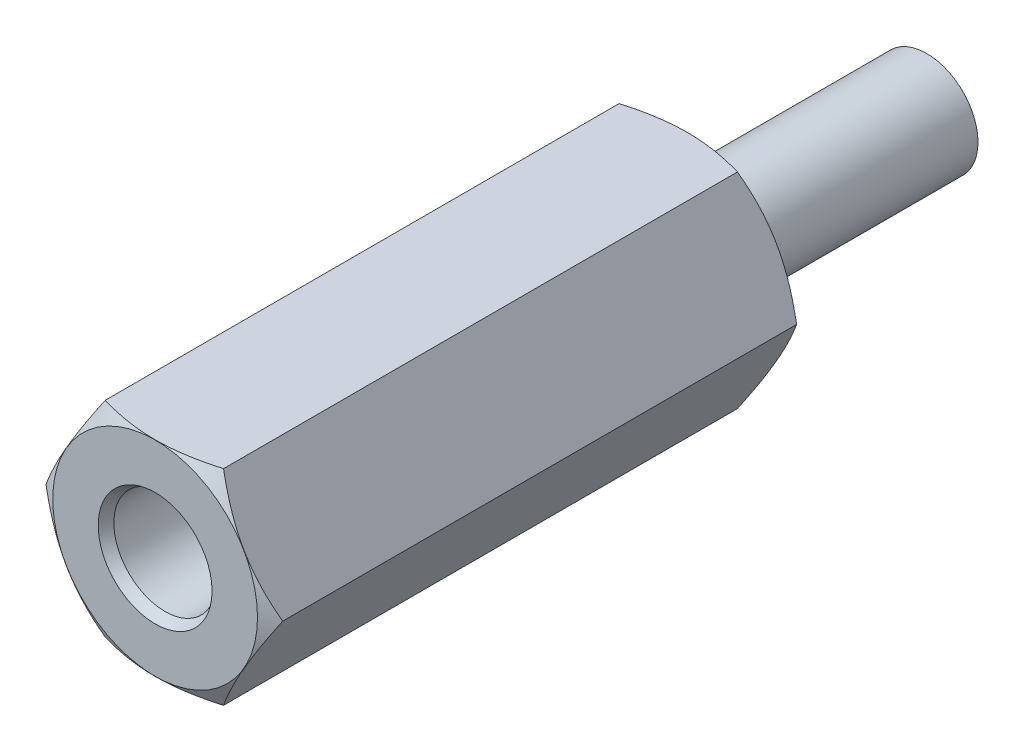
ISO-10303-21;
HEADER;
FILE_DESCRIPTION(('STEP AP214'),'2;1');
FILE_NAME('part.step','',(''),(''),'','','');
FILE_SCHEMA(('AUTOMOTIVE_DESIGN { 1 0 10303 214 1 1 1 1 }'));
ENDSEC;
DATA;
#1=APPLICATION_CONTEXT('core data for automotive mechanical design processes');
#2=APPLICATION_PROTOCOL_DEFINITION('international standard','automotive_design',2000,#1);
#3=PRODUCT_CONTEXT('',#1,'mechanical');
#4=PRODUCT('Part','Part','',(#3));
#5=PRODUCT_RELATED_PRODUCT_CATEGORY('part','',(#4));
#6=PRODUCT_DEFINITION_FORMATION('','',#4);
#7=PRODUCT_DEFINITION_CONTEXT('part definition',#1,'design');
#8=PRODUCT_DEFINITION('design','',#6,#7);
#9=PRODUCT_DEFINITION_SHAPE('','',#8);
#10=(LENGTH_UNIT() NAMED_UNIT(*) SI_UNIT(.MILLI.,.METRE.));
#11=(NAMED_UNIT(*) PLANE_ANGLE_UNIT() SI_UNIT($,.RADIAN.));
#12=(NAMED_UNIT(*) SI_UNIT($,.STERADIAN.) SOLID_ANGLE_UNIT());
#13=UNCERTAINTY_MEASURE_WITH_UNIT(LENGTH_MEASURE(1.E-05),#10,'distance_accuracy_value','');
#14=(GEOMETRIC_REPRESENTATION_CONTEXT(3) GLOBAL_UNCERTAINTY_ASSIGNED_CONTEXT((#13)) GLOBAL_UNIT_ASSIGNED_CONTEXT((#10,
#11,#12)) REPRESENTATION_CONTEXT('',''));
#15=CARTESIAN_POINT('',(0.,0.,0.));
#16=DIRECTION('',(0.,0.,1.));
#17=DIRECTION('',(1.,0.,0.));
#18=AXIS2_PLACEMENT_3D('',#15,#16,#17);
#19=CARTESIAN_POINT('',(0.,0.,7.));
#20=DIRECTION('',(0.,0.,1.));
#21=DIRECTION('',(1.,0.,0.));
#22=AXIS2_PLACEMENT_3D('',#19,#20,#21);
#23=CONICAL_SURFACE('',#22,1.25,1.047197551197);
#24=CARTESIAN_POINT('',(0.,0.,7.));
#25=DIRECTION('',(0.,0.,1.));
#26=DIRECTION('',(1.,0.,0.));
#27=AXIS2_PLACEMENT_3D('',#24,#25,#26);
#28=CIRCLE('',#27,1.25);
#29=CARTESIAN_POINT('',(1.25,0.,7.));
#30=VERTEX_POINT('',#29);
#31=EDGE_CURVE('E26',#30,#30,#28,.T.);
#32=ORIENTED_EDGE('',*,*,#31,.T.);
#33=DIRECTION('',(-0.866025403784329,0.,-0.50000000000019));
#34=VECTOR('',#33,1.);
#35=CARTESIAN_POINT('',(1.25,0.,7.));
#36=LINE('',#35,#34);
#37=CARTESIAN_POINT('',(0.,0.,6.278312163513));
#38=VERTEX_POINT('',#37);
#39=EDGE_CURVE('E11',#30,#38,#36,.T.);
#40=ORIENTED_EDGE('',*,*,#39,.T.);
#41=ORIENTED_EDGE('',*,*,#39,.F.);
#42=EDGE_LOOP('',(#32,#40,#41));
#43=FACE_BOUND('',#42,.T.);
#44=ADVANCED_FACE('F16',(#43),#23,.F.);
#45=CARTESIAN_POINT('',(0.,0.,-6.));
#46=DIRECTION('',(0.,0.,1.));
#47=DIRECTION('',(1.,0.,0.));
#48=AXIS2_PLACEMENT_3D('',#45,#46,#47);
#49=PLANE('',#48);
#50=CARTESIAN_POINT('',(0.,0.,-6.));
#51=DIRECTION('',(0.,0.,1.));
#52=DIRECTION('',(1.,0.,0.));
#53=AXIS2_PLACEMENT_3D('',#50,#51,#52);
#54=CIRCLE('',#53,0.98);
#55=CARTESIAN_POINT('',(0.98,0.,-6.));
#56=VERTEX_POINT('',#55);
#57=EDGE_CURVE('E100',#56,#56,#54,.T.);
#58=ORIENTED_EDGE('',*,*,#57,.F.);
#59=EDGE_LOOP('',(#58));
#60=FACE_BOUND('',#59,.T.);
#61=ADVANCED_FACE('F297',(#60),#49,.F.);
#62=CARTESIAN_POINT('',(0.,0.,12.75751288694));
#63=DIRECTION('',(0.,0.,-1.));
#64=DIRECTION('',(1.,0.,0.));
#65=AXIS2_PLACEMENT_3D('',#62,#63,#64);
#66=CYLINDRICAL_SURFACE('',#65,1.25);
#67=CARTESIAN_POINT('',(0.,0.,12.75751288694));
#68=DIRECTION('',(0.,0.,1.));
#69=DIRECTION('',(1.,0.,0.));
#70=AXIS2_PLACEMENT_3D('',#67,#68,#69);
#71=CIRCLE('',#70,1.25);
#72=CARTESIAN_POINT('',(1.25,0.,12.75751288694));
#73=VERTEX_POINT('',#72);
#74=EDGE_CURVE('E114',#73,#73,#71,.T.);
#75=ORIENTED_EDGE('',*,*,#74,.T.);
#76=DIRECTION('',(0.,0.,-1.));
#77=VECTOR('',#76,1.);
#78=CARTESIAN_POINT('',(1.25,0.,12.75751288694));
#79=LINE('',#78,#77);
#80=EDGE_CURVE('E105',#73,#30,#79,.T.);
#81=ORIENTED_EDGE('',*,*,#80,.T.);
#82=ORIENTED_EDGE('',*,*,#31,.F.);
#83=ORIENTED_EDGE('',*,*,#80,.F.);
#84=EDGE_LOOP('',(#75,#81,#82,#83));
#85=FACE_BOUND('',#84,.T.);
#86=ADVANCED_FACE('F294',(#85),#66,.F.);
#87=CARTESIAN_POINT('',(0.,0.,-6.));
#88=DIRECTION('',(0.,0.,1.));
#89=DIRECTION('',(1.,0.,0.));
#90=AXIS2_PLACEMENT_3D('',#87,#88,#89);
#91=CONICAL_SURFACE('',#90,0.98,1.047197551197);
#92=ORIENTED_EDGE('',*,*,#57,.T.);
#93=DIRECTION('',(0.866025403784329,0.,0.50000000000019));
#94=VECTOR('',#93,1.);
#95=CARTESIAN_POINT('',(0.98,0.,-6.));
#96=LINE('',#95,#94);
#97=CARTESIAN_POINT('',(1.25,0.,-5.844115427319));
#98=VERTEX_POINT('',#97);
#99=EDGE_CURVE('E97',#56,#98,#96,.T.);
#100=ORIENTED_EDGE('',*,*,#99,.T.);
#101=CARTESIAN_POINT('',(0.,0.,-5.844115427319));
#102=DIRECTION('',(0.,0.,1.));
#103=DIRECTION('',(1.,0.,0.));
#104=AXIS2_PLACEMENT_3D('',#101,#102,#103);
#105=CIRCLE('',#104,1.25);
#106=EDGE_CURVE('E102',#98,#98,#105,.T.);
#107=ORIENTED_EDGE('',*,*,#106,.F.);
#108=ORIENTED_EDGE('',*,*,#99,.F.);
#109=EDGE_LOOP('',(#92,#100,#107,#108));
#110=FACE_BOUND('',#109,.T.);
#111=ADVANCED_FACE('F98',(#110),#91,.T.);
#112=CARTESIAN_POINT('',(0.,0.,13.));
#113=DIRECTION('',(0.,0.,1.));
#114=DIRECTION('',(1.,0.,0.));
#115=AXIS2_PLACEMENT_3D('',#112,#113,#114);
#116=CONICAL_SURFACE('',#115,1.39,0.523598775598);
#117=CARTESIAN_POINT('',(0.,0.,13.));
#118=DIRECTION('',(0.,0.,1.));
#119=DIRECTION('',(1.,0.,0.));
#120=AXIS2_PLACEMENT_3D('',#117,#118,#119);
#121=CIRCLE('',#120,1.39);
#122=CARTESIAN_POINT('',(1.39,0.,13.));
#123=VERTEX_POINT('',#122);
#124=EDGE_CURVE('E136',#123,#123,#121,.T.);
#125=ORIENTED_EDGE('',*,*,#124,.T.);
#126=DIRECTION('',(-0.50000000000019,0.,-0.866025403784329));
#127=VECTOR('',#126,1.);
#128=CARTESIAN_POINT('',(1.39,0.,13.));
#129=LINE('',#128,#127);
#130=EDGE_CURVE('E199',#123,#73,#129,.T.);
#131=ORIENTED_EDGE('',*,*,#130,.T.);
#132=ORIENTED_EDGE('',*,*,#74,.F.);
#133=ORIENTED_EDGE('',*,*,#130,.F.);
#134=EDGE_LOOP('',(#125,#131,#132,#133));
#135=FACE_BOUND('',#134,.T.);
#136=ADVANCED_FACE('F291',(#135),#116,.F.);
#137=CARTESIAN_POINT('',(0.,0.,-5.844115427319));
#138=DIRECTION('',(0.,0.,1.));
#139=DIRECTION('',(1.,0.,0.));
#140=AXIS2_PLACEMENT_3D('',#137,#138,#139);
#141=CYLINDRICAL_SURFACE('',#140,1.25);
#142=ORIENTED_EDGE('',*,*,#106,.T.);
#143=DIRECTION('',(0.,0.,1.));
#144=VECTOR('',#143,1.);
#145=CARTESIAN_POINT('',(1.25,0.,-5.844115427319));
#146=LINE('',#145,#144);
#147=CARTESIAN_POINT('',(1.25,0.,0.));
#148=VERTEX_POINT('',#147);
#149=EDGE_CURVE('E203',#98,#148,#146,.T.);
#150=ORIENTED_EDGE('',*,*,#149,.T.);
#151=CARTESIAN_POINT('',(0.,0.,0.));
#152=DIRECTION('',(0.,0.,1.));
#153=DIRECTION('',(1.,0.,0.));
#154=AXIS2_PLACEMENT_3D('',#151,#152,#153);
#155=CIRCLE('',#154,1.25);
#156=EDGE_CURVE('E140',#148,#148,#155,.T.);
#157=ORIENTED_EDGE('',*,*,#156,.F.);
#158=ORIENTED_EDGE('',*,*,#149,.F.);
#159=EDGE_LOOP('',(#142,#150,#157,#158));
#160=FACE_BOUND('',#159,.T.);
#161=ADVANCED_FACE('F325',(#160),#141,.T.);
#162=CARTESIAN_POINT('',(0.,0.,13.));
#163=DIRECTION('',(0.,0.,1.));
#164=DIRECTION('',(1.,0.,0.));
#165=AXIS2_PLACEMENT_3D('',#162,#163,#164);
#166=PLANE('',#165);
#167=ORIENTED_EDGE('',*,*,#124,.F.);
#168=EDGE_LOOP('',(#167));
#169=FACE_BOUND('',#168,.T.);
#170=CARTESIAN_POINT('',(0.,0.,13.));
#171=DIRECTION('',(0.,0.,1.));
#172=DIRECTION('',(1.,0.,0.));
#173=AXIS2_PLACEMENT_3D('',#170,#171,#172);
#174=CIRCLE('',#173,2.5);
#175=CARTESIAN_POINT('',(2.5,0.,13.));
#176=VERTEX_POINT('',#175);
#177=EDGE_CURVE('E156',#176,#176,#174,.T.);
#178=ORIENTED_EDGE('',*,*,#177,.T.);
#179=EDGE_LOOP('',(#178));
#180=FACE_BOUND('',#179,.T.);
#181=ADVANCED_FACE('F326',(#169,#180),#166,.T.);
#182=CARTESIAN_POINT('',(0.,0.,0.));
#183=DIRECTION('',(0.,0.,1.));
#184=DIRECTION('',(1.,0.,0.));
#185=AXIS2_PLACEMENT_3D('',#182,#183,#184);
#186=PLANE('',#185);
#187=CARTESIAN_POINT('',(0.,0.,0.));
#188=DIRECTION('',(0.,0.,1.));
#189=DIRECTION('',(1.,0.,0.));
#190=AXIS2_PLACEMENT_3D('',#187,#188,#189);
#191=CIRCLE('',#190,2.5);
#192=CARTESIAN_POINT('',(2.5,0.,0.));
#193=VERTEX_POINT('',#192);
#194=EDGE_CURVE('E134',#193,#193,#191,.T.);
#195=ORIENTED_EDGE('',*,*,#194,.F.);
#196=EDGE_LOOP('',(#195));
#197=FACE_BOUND('',#196,.T.);
#198=ORIENTED_EDGE('',*,*,#156,.T.);
#199=EDGE_LOOP('',(#198));
#200=FACE_BOUND('',#199,.T.);
#201=ADVANCED_FACE('F329',(#197,#200),#186,.F.);
#202=CARTESIAN_POINT('',(-1.445,-2.502813416937,-10.));
#203=DIRECTION('',(0.,1.,0.));
#204=DIRECTION('',(1.,0.,0.));
#205=AXIS2_PLACEMENT_3D('',#202,#203,#204);
#206=PLANE('',#205);
#207=DIRECTION('',(0.,0.,1.));
#208=VECTOR('',#207,1.);
#209=CARTESIAN_POINT('',(1.445,-2.502813416937,-10.));
#210=LINE('',#209,#208);
#211=CARTESIAN_POINT('',(1.445,-2.502813416937,0.225166604984));
#212=VERTEX_POINT('',#211);
#213=CARTESIAN_POINT('',(1.445,-2.502813416937,12.774833395016));
#214=VERTEX_POINT('',#213);
#215=EDGE_CURVE('E146',#212,#214,#210,.T.);
#216=ORIENTED_EDGE('',*,*,#215,.T.);
#217=CARTESIAN_POINT('',(1.44500000000008,-2.502813416937,12.7748333950159));
#218=CARTESIAN_POINT('',(0.,-2.50281341693701,13.1919689645055));
#219=CARTESIAN_POINT('',(-1.44499999999997,-2.502813416937,12.774833395016));
#220=(BOUNDED_CURVE() B_SPLINE_CURVE(2,(#217,#218,#219),.UNSPECIFIED.,.F.,
.F.) B_SPLINE_CURVE_WITH_KNOTS((3,3),(0.,1.),
.UNSPECIFIED.) CURVE() GEOMETRIC_REPRESENTATION_ITEM() RATIONAL_B_SPLINE_CURVE((1.,
1.15470053837926,1.)) REPRESENTATION_ITEM(''));
#221=CARTESIAN_POINT('',(-1.445,-2.502813416937,12.774833395016));
#222=VERTEX_POINT('',#221);
#223=EDGE_CURVE('E141',#214,#222,#220,.T.);
#224=ORIENTED_EDGE('',*,*,#223,.T.);
#225=DIRECTION('',(0.,0.,1.));
#226=VECTOR('',#225,1.);
#227=CARTESIAN_POINT('',(-1.445,-2.502813416937,-10.));
#228=LINE('',#227,#226);
#229=CARTESIAN_POINT('',(-1.445,-2.502813416937,0.225166604984));
#230=VERTEX_POINT('',#229);
#231=EDGE_CURVE('E236',#230,#222,#228,.T.);
#232=ORIENTED_EDGE('',*,*,#231,.F.);
#233=CARTESIAN_POINT('',(-1.44500000000008,-2.502813416937,0.225166604984046));
#234=CARTESIAN_POINT('',(0.,-2.50281341693701,-0.191968964505495));
#235=CARTESIAN_POINT('',(1.44499999999997,-2.502813416937,0.225166604984016));
#236=(BOUNDED_CURVE() B_SPLINE_CURVE(2,(#233,#234,#235),.UNSPECIFIED.,.F.,
.F.) B_SPLINE_CURVE_WITH_KNOTS((3,3),(0.,1.),
.UNSPECIFIED.) CURVE() GEOMETRIC_REPRESENTATION_ITEM() RATIONAL_B_SPLINE_CURVE((1.,
1.15470053837926,1.)) REPRESENTATION_ITEM(''));
#237=EDGE_CURVE('E120',#230,#212,#236,.T.);
#238=ORIENTED_EDGE('',*,*,#237,.T.);
#239=EDGE_LOOP('',(#216,#224,#232,#238));
#240=FACE_BOUND('',#239,.T.);
#241=ADVANCED_FACE('F333',(#240),#206,.F.);
#242=CARTESIAN_POINT('',(-2.89,0.,-10.));
#243=DIRECTION('',(0.866025403784329,0.50000000000019,0.));
#244=DIRECTION('',(0.,0.,-1.));
#245=AXIS2_PLACEMENT_3D('',#242,#243,#244);
#246=PLANE('',#245);
#247=ORIENTED_EDGE('',*,*,#231,.T.);
#248=CARTESIAN_POINT('',(-1.44499999999986,-2.50281341693713,12.7748333950159));
#249=CARTESIAN_POINT('',(-2.16750000000005,-1.25140670846891,13.1919689645056));
#250=CARTESIAN_POINT('',(-2.89000000000029,-6.22391027604863E-13,12.7748333950158));
#251=(BOUNDED_CURVE() B_SPLINE_CURVE(2,(#248,#249,#250),.UNSPECIFIED.,.F.,
.F.) B_SPLINE_CURVE_WITH_KNOTS((3,3),(0.,1.),
.UNSPECIFIED.) CURVE() GEOMETRIC_REPRESENTATION_ITEM() RATIONAL_B_SPLINE_CURVE((1.,
1.15470053837933,1.)) REPRESENTATION_ITEM(''));
#252=CARTESIAN_POINT('',(-2.89,0.,12.774833395016));
#253=VERTEX_POINT('',#252);
#254=EDGE_CURVE('E147',#222,#253,#251,.T.);
#255=ORIENTED_EDGE('',*,*,#254,.T.);
#256=DIRECTION('',(0.,0.,1.));
#257=VECTOR('',#256,1.);
#258=CARTESIAN_POINT('',(-2.89,0.,-10.));
#259=LINE('',#258,#257);
#260=CARTESIAN_POINT('',(-2.89,0.,0.225166604984));
#261=VERTEX_POINT('',#260);
#262=EDGE_CURVE('E118',#261,#253,#259,.T.);
#263=ORIENTED_EDGE('',*,*,#262,.F.);
#264=CARTESIAN_POINT('',(-2.89000000000094,5.09592368302947E-13,0.225166604984566));
#265=CARTESIAN_POINT('',(-2.16750000000034,-1.2514067084684,-0.191968964505698));
#266=CARTESIAN_POINT('',(-1.44499999999998,-2.50281341693691,0.225166604984036));
#267=(BOUNDED_CURVE() B_SPLINE_CURVE(2,(#264,#265,#266),.UNSPECIFIED.,.F.,
.F.) B_SPLINE_CURVE_WITH_KNOTS((3,3),(0.,1.),
.UNSPECIFIED.) CURVE() GEOMETRIC_REPRESENTATION_ITEM() RATIONAL_B_SPLINE_CURVE((1.,
1.15470053837945,1.)) REPRESENTATION_ITEM(''));
#268=EDGE_CURVE('E125',#261,#230,#267,.T.);
#269=ORIENTED_EDGE('',*,*,#268,.T.);
#270=EDGE_LOOP('',(#247,#255,#263,#269));
#271=FACE_BOUND('',#270,.T.);
#272=ADVANCED_FACE('F314',(#271),#246,.F.);
#273=CARTESIAN_POINT('',(-1.445,2.502813416937,-10.));
#274=DIRECTION('',(0.866025403784329,-0.50000000000019,0.));
#275=DIRECTION('',(0.,0.,-1.));
#276=AXIS2_PLACEMENT_3D('',#273,#274,#275);
#277=PLANE('',#276);
#278=ORIENTED_EDGE('',*,*,#262,.T.);
#279=CARTESIAN_POINT('',(-2.89000000000108,-7.48068273992431E-13,12.7748333950154));
#280=CARTESIAN_POINT('',(-2.1675000000004,1.25140670846831,13.1919689645058));
#281=CARTESIAN_POINT('',(-1.44499999999998,2.50281341693692,12.774833395016));
#282=(BOUNDED_CURVE() B_SPLINE_CURVE(2,(#279,#280,#281),.UNSPECIFIED.,.F.,
.F.) B_SPLINE_CURVE_WITH_KNOTS((3,3),(0.,1.),
.UNSPECIFIED.) CURVE() GEOMETRIC_REPRESENTATION_ITEM() RATIONAL_B_SPLINE_CURVE((1.,
1.15470053837947,1.)) REPRESENTATION_ITEM(''));
#283=CARTESIAN_POINT('',(-1.445,2.502813416937,12.774833395016));
#284=VERTEX_POINT('',#283);
#285=EDGE_CURVE('E169',#253,#284,#282,.T.);
#286=ORIENTED_EDGE('',*,*,#285,.T.);
#287=DIRECTION('',(0.,0.,1.));
#288=VECTOR('',#287,1.);
#289=CARTESIAN_POINT('',(-1.445,2.502813416937,-10.));
#290=LINE('',#289,#288);
#291=CARTESIAN_POINT('',(-1.445,2.502813416937,0.225166604984));
#292=VERTEX_POINT('',#291);
#293=EDGE_CURVE('E19',#292,#284,#290,.T.);
#294=ORIENTED_EDGE('',*,*,#293,.F.);
#295=CARTESIAN_POINT('',(-1.44499999999986,2.50281341693713,0.225166604984106));
#296=CARTESIAN_POINT('',(-2.16750000000007,1.25140670846888,-0.191968964505593));
#297=CARTESIAN_POINT('',(-2.89000000000033,5.42899059041702E-13,0.225166604984216));
#298=(BOUNDED_CURVE() B_SPLINE_CURVE(2,(#295,#296,#297),.UNSPECIFIED.,.F.,
.F.) B_SPLINE_CURVE_WITH_KNOTS((3,3),(0.,1.),
.UNSPECIFIED.) CURVE() GEOMETRIC_REPRESENTATION_ITEM() RATIONAL_B_SPLINE_CURVE((1.,
1.15470053837935,1.)) REPRESENTATION_ITEM(''));
#299=EDGE_CURVE('E183',#292,#261,#298,.T.);
#300=ORIENTED_EDGE('',*,*,#299,.T.);
#301=EDGE_LOOP('',(#278,#286,#294,#300));
#302=FACE_BOUND('',#301,.T.);
#303=ADVANCED_FACE('F310',(#302),#277,.F.);
#304=CARTESIAN_POINT('',(1.445,-2.502813416937,-10.));
#305=DIRECTION('',(-0.866025403784329,0.50000000000019,0.));
#306=DIRECTION('',(0.,0.,1.));
#307=AXIS2_PLACEMENT_3D('',#304,#305,#306);
#308=PLANE('',#307);
#309=DIRECTION('',(0.,0.,1.));
#310=VECTOR('',#309,1.);
#311=CARTESIAN_POINT('',(2.89,0.,0.225166604984));
#312=LINE('',#311,#310);
#313=CARTESIAN_POINT('',(2.89,0.,0.225166604984));
#314=VERTEX_POINT('',#313);
#315=CARTESIAN_POINT('',(2.89,0.,12.774833395016));
#316=VERTEX_POINT('',#315);
#317=EDGE_CURVE('E163',#314,#316,#312,.T.);
#318=ORIENTED_EDGE('',*,*,#317,.T.);
#319=CARTESIAN_POINT('',(2.89000000000101,6.32827124036339E-13,12.7748333950154));
#320=CARTESIAN_POINT('',(2.16750000000037,-1.25140670846836,13.1919689645057));
#321=CARTESIAN_POINT('',(1.44499999999998,-2.50281341693692,12.774833395016));
#322=(BOUNDED_CURVE() B_SPLINE_CURVE(2,(#319,#320,#321),.UNSPECIFIED.,.F.,
.F.) B_SPLINE_CURVE_WITH_KNOTS((3,3),(0.,1.),
.UNSPECIFIED.) CURVE() GEOMETRIC_REPRESENTATION_ITEM() RATIONAL_B_SPLINE_CURVE((1.,
1.15470053837946,1.)) REPRESENTATION_ITEM(''));
#323=EDGE_CURVE('E157',#316,#214,#322,.T.);
#324=ORIENTED_EDGE('',*,*,#323,.T.);
#325=ORIENTED_EDGE('',*,*,#215,.F.);
#326=CARTESIAN_POINT('',(1.44499999999986,-2.50281341693713,0.225166604984106));
#327=CARTESIAN_POINT('',(2.16750000000006,-1.25140670846889,-0.191968964505588));
#328=CARTESIAN_POINT('',(2.89000000000031,-5.83089132533132E-13,0.225166604984202));
#329=(BOUNDED_CURVE() B_SPLINE_CURVE(2,(#326,#327,#328),.UNSPECIFIED.,.F.,
.F.) B_SPLINE_CURVE_WITH_KNOTS((3,3),(0.,1.),
.UNSPECIFIED.) CURVE() GEOMETRIC_REPRESENTATION_ITEM() RATIONAL_B_SPLINE_CURVE((1.,
1.15470053837935,1.)) REPRESENTATION_ITEM(''));
#330=EDGE_CURVE('E126',#212,#314,#329,.T.);
#331=ORIENTED_EDGE('',*,*,#330,.T.);
#332=EDGE_LOOP('',(#318,#324,#325,#331));
#333=FACE_BOUND('',#332,.T.);
#334=ADVANCED_FACE('F313',(#333),#308,.F.);
#335=CARTESIAN_POINT('',(0.,0.,12.774833395016));
#336=DIRECTION('',(0.,0.,-1.));
#337=DIRECTION('',(1.,0.,0.));
#338=AXIS2_PLACEMENT_3D('',#335,#336,#337);
#339=CONICAL_SURFACE('',#338,2.89,1.047197551197);
#340=ORIENTED_EDGE('',*,*,#323,.F.);
#341=DIRECTION('',(-0.866025403784329,0.,0.50000000000019));
#342=VECTOR('',#341,1.);
#343=CARTESIAN_POINT('',(2.89,0.,12.774833395016));
#344=LINE('',#343,#342);
#345=EDGE_CURVE('E152',#316,#176,#344,.T.);
#346=ORIENTED_EDGE('',*,*,#345,.T.);
#347=ORIENTED_EDGE('',*,*,#177,.F.);
#348=ORIENTED_EDGE('',*,*,#345,.F.);
#349=CARTESIAN_POINT('',(1.44499999999986,2.50281341693713,12.7748333950159));
#350=CARTESIAN_POINT('',(2.16750000000006,1.25140670846889,13.1919689645056));
#351=CARTESIAN_POINT('',(2.89000000000031,5.83977310952832E-13,12.7748333950158));
#352=(BOUNDED_CURVE() B_SPLINE_CURVE(2,(#349,#350,#351),.UNSPECIFIED.,.F.,
.F.) B_SPLINE_CURVE_WITH_KNOTS((3,3),(0.,1.),
.UNSPECIFIED.) CURVE() GEOMETRIC_REPRESENTATION_ITEM() RATIONAL_B_SPLINE_CURVE((1.,
1.15470053837934,1.)) REPRESENTATION_ITEM(''));
#353=CARTESIAN_POINT('',(1.445,2.502813416937,12.774833395016));
#354=VERTEX_POINT('',#353);
#355=EDGE_CURVE('E208',#354,#316,#352,.T.);
#356=ORIENTED_EDGE('',*,*,#355,.F.);
#357=CARTESIAN_POINT('',(-1.44500000000008,2.502813416937,12.7748333950159));
#358=CARTESIAN_POINT('',(0.,2.50281341693701,13.1919689645055));
#359=CARTESIAN_POINT('',(1.44499999999997,2.502813416937,12.774833395016));
#360=(BOUNDED_CURVE() B_SPLINE_CURVE(2,(#357,#358,#359),.UNSPECIFIED.,.F.,
.F.) B_SPLINE_CURVE_WITH_KNOTS((3,3),(0.,1.),
.UNSPECIFIED.) CURVE() GEOMETRIC_REPRESENTATION_ITEM() RATIONAL_B_SPLINE_CURVE((1.,
1.15470053837926,1.)) REPRESENTATION_ITEM(''));
#361=EDGE_CURVE('E192',#284,#354,#360,.T.);
#362=ORIENTED_EDGE('',*,*,#361,.F.);
#363=ORIENTED_EDGE('',*,*,#285,.F.);
#364=ORIENTED_EDGE('',*,*,#254,.F.);
#365=ORIENTED_EDGE('',*,*,#223,.F.);
#366=EDGE_LOOP('',(#340,#346,#347,#348,#356,#362,#363,#364,#365));
#367=FACE_BOUND('',#366,.T.);
#368=ADVANCED_FACE('F316',(#367),#339,.T.);
#369=CARTESIAN_POINT('',(1.445,2.502813416937,-10.));
#370=DIRECTION('',(0.,-1.,0.));
#371=DIRECTION('',(-1.,0.,0.));
#372=AXIS2_PLACEMENT_3D('',#369,#370,#371);
#373=PLANE('',#372);
#374=ORIENTED_EDGE('',*,*,#293,.T.);
#375=ORIENTED_EDGE('',*,*,#361,.T.);
#376=DIRECTION('',(0.,0.,1.));
#377=VECTOR('',#376,1.);
#378=CARTESIAN_POINT('',(1.445,2.502813416937,-10.));
#379=LINE('',#378,#377);
#380=CARTESIAN_POINT('',(1.445,2.502813416937,0.225166604984));
#381=VERTEX_POINT('',#380);
#382=EDGE_CURVE('E217',#381,#354,#379,.T.);
#383=ORIENTED_EDGE('',*,*,#382,.F.);
#384=CARTESIAN_POINT('',(1.44500000000008,2.502813416937,0.225166604984046));
#385=CARTESIAN_POINT('',(0.,2.50281341693701,-0.191968964505495));
#386=CARTESIAN_POINT('',(-1.44499999999997,2.502813416937,0.225166604984016));
#387=(BOUNDED_CURVE() B_SPLINE_CURVE(2,(#384,#385,#386),.UNSPECIFIED.,.F.,
.F.) B_SPLINE_CURVE_WITH_KNOTS((3,3),(0.,1.),
.UNSPECIFIED.) CURVE() GEOMETRIC_REPRESENTATION_ITEM() RATIONAL_B_SPLINE_CURVE((1.,
1.15470053837926,1.)) REPRESENTATION_ITEM(''));
#388=EDGE_CURVE('E245',#381,#292,#387,.T.);
#389=ORIENTED_EDGE('',*,*,#388,.T.);
#390=EDGE_LOOP('',(#374,#375,#383,#389));
#391=FACE_BOUND('',#390,.T.);
#392=ADVANCED_FACE('F273',(#391),#373,.F.);
#393=CARTESIAN_POINT('',(0.,0.,0.));
#394=DIRECTION('',(0.,0.,1.));
#395=DIRECTION('',(1.,0.,0.));
#396=AXIS2_PLACEMENT_3D('',#393,#394,#395);
#397=CONICAL_SURFACE('',#396,2.5,1.047197551197);
#398=DIRECTION('',(0.866025403784329,0.,0.50000000000019));
#399=VECTOR('',#398,1.);
#400=CARTESIAN_POINT('',(2.5,0.,0.));
#401=LINE('',#400,#399);
#402=EDGE_CURVE('E127',#193,#314,#401,.T.);
#403=ORIENTED_EDGE('',*,*,#402,.F.);
#404=ORIENTED_EDGE('',*,*,#194,.T.);
#405=ORIENTED_EDGE('',*,*,#402,.T.);
#406=ORIENTED_EDGE('',*,*,#330,.F.);
#407=ORIENTED_EDGE('',*,*,#237,.F.);
#408=ORIENTED_EDGE('',*,*,#268,.F.);
#409=ORIENTED_EDGE('',*,*,#299,.F.);
#410=ORIENTED_EDGE('',*,*,#388,.F.);
#411=CARTESIAN_POINT('',(2.89000000000101,-6.28830321147689E-13,0.225166604984606));
#412=CARTESIAN_POINT('',(2.16750000000037,1.25140670846836,-0.191968964505713));
#413=CARTESIAN_POINT('',(1.44499999999998,2.50281341693691,0.225166604984036));
#414=(BOUNDED_CURVE() B_SPLINE_CURVE(2,(#411,#412,#413),.UNSPECIFIED.,.F.,
.F.) B_SPLINE_CURVE_WITH_KNOTS((3,3),(0.,1.),
.UNSPECIFIED.) CURVE() GEOMETRIC_REPRESENTATION_ITEM() RATIONAL_B_SPLINE_CURVE((1.,
1.15470053837946,1.)) REPRESENTATION_ITEM(''));
#415=EDGE_CURVE('E135',#314,#381,#414,.T.);
#416=ORIENTED_EDGE('',*,*,#415,.F.);
#417=EDGE_LOOP('',(#403,#404,#405,#406,#407,#408,#409,#410,#416));
#418=FACE_BOUND('',#417,.T.);
#419=ADVANCED_FACE('F320',(#418),#397,.T.);
#420=CARTESIAN_POINT('',(2.89,0.,-10.));
#421=DIRECTION('',(-0.866025403784329,-0.50000000000019,0.));
#422=DIRECTION('',(-0.50000000000019,0.866025403784329,0.));
#423=AXIS2_PLACEMENT_3D('',#420,#421,#422);
#424=PLANE('',#423);
#425=ORIENTED_EDGE('',*,*,#382,.T.);
#426=ORIENTED_EDGE('',*,*,#355,.T.);
#427=ORIENTED_EDGE('',*,*,#317,.F.);
#428=ORIENTED_EDGE('',*,*,#415,.T.);
#429=EDGE_LOOP('',(#425,#426,#427,#428));
#430=FACE_BOUND('',#429,.T.);
#431=ADVANCED_FACE('F267',(#430),#424,.F.);
#432=CLOSED_SHELL('',(#44,#61,#86,#111,#136,#161,#181,#201,#241,#272,#303,#334,#368,#392,#419,#431));
#433=MANIFOLD_SOLID_BREP('B1',#432);
#434=ADVANCED_BREP_SHAPE_REPRESENTATION('',(#18,#433),#14);
#435=SHAPE_DEFINITION_REPRESENTATION(#9,#434);
ENDSEC;
END-ISO-10303-21;
